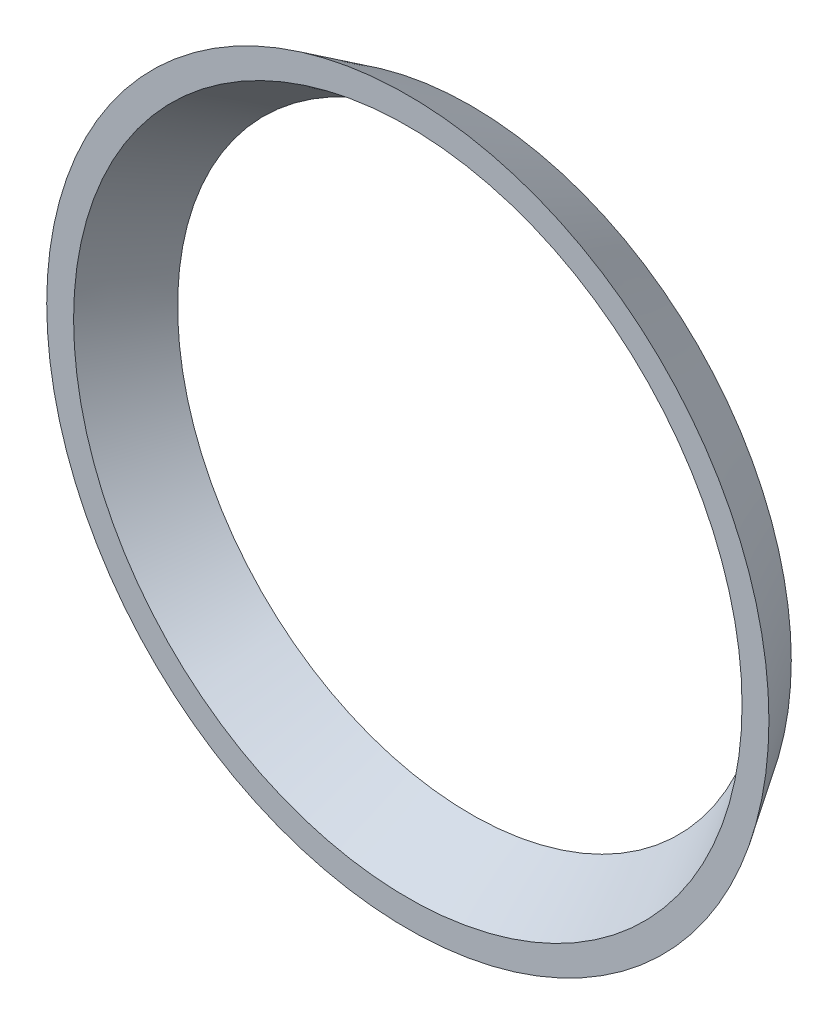
ISO-10303-21;
HEADER;
FILE_DESCRIPTION(('STEP AP214'),'2;1');
FILE_NAME('part.step','',(''),(''),'','','');
FILE_SCHEMA(('AUTOMOTIVE_DESIGN { 1 0 10303 214 1 1 1 1 }'));
ENDSEC;
DATA;
#1=APPLICATION_CONTEXT('core data for automotive mechanical design processes');
#2=APPLICATION_PROTOCOL_DEFINITION('international standard','automotive_design',2000,#1);
#3=PRODUCT_CONTEXT('',#1,'mechanical');
#4=PRODUCT('Part','Part','',(#3));
#5=PRODUCT_RELATED_PRODUCT_CATEGORY('part','',(#4));
#6=PRODUCT_DEFINITION_FORMATION('','',#4);
#7=PRODUCT_DEFINITION_CONTEXT('part definition',#1,'design');
#8=PRODUCT_DEFINITION('design','',#6,#7);
#9=PRODUCT_DEFINITION_SHAPE('','',#8);
#10=(LENGTH_UNIT() NAMED_UNIT(*) SI_UNIT(.MILLI.,.METRE.));
#11=(NAMED_UNIT(*) PLANE_ANGLE_UNIT() SI_UNIT($,.RADIAN.));
#12=(NAMED_UNIT(*) SI_UNIT($,.STERADIAN.) SOLID_ANGLE_UNIT());
#13=UNCERTAINTY_MEASURE_WITH_UNIT(LENGTH_MEASURE(1.E-05),#10,'distance_accuracy_value','');
#14=(GEOMETRIC_REPRESENTATION_CONTEXT(3) GLOBAL_UNCERTAINTY_ASSIGNED_CONTEXT((#13)) GLOBAL_UNIT_ASSIGNED_CONTEXT((#10,
#11,#12)) REPRESENTATION_CONTEXT('',''));
#15=CARTESIAN_POINT('',(0.,0.,0.));
#16=DIRECTION('',(0.,0.,1.));
#17=DIRECTION('',(1.,0.,0.));
#18=AXIS2_PLACEMENT_3D('',#15,#16,#17);
#19=CARTESIAN_POINT('',(0.,18.5117216199572,0.));
#20=DIRECTION('',(0.,0.,-1.));
#21=DIRECTION('',(-1.,0.,0.));
#22=AXIS2_PLACEMENT_3D('',#19,#20,#21);
#23=PLANE('',#22);
#24=CARTESIAN_POINT('',(0.,0.,0.));
#25=DIRECTION('',(0.,0.,1.));
#26=DIRECTION('',(1.,0.,0.));
#27=AXIS2_PLACEMENT_3D('',#24,#25,#26);
#28=CIRCLE('',#27,18.5117216199572);
#29=CARTESIAN_POINT('',(18.5117216199572,0.,0.));
#30=VERTEX_POINT('',#29);
#31=EDGE_CURVE('E53',#30,#30,#28,.T.);
#32=ORIENTED_EDGE('',*,*,#31,.F.);
#33=EDGE_LOOP('',(#32));
#34=FACE_BOUND('',#33,.T.);
#35=CARTESIAN_POINT('',(0.,0.,0.));
#36=DIRECTION('',(0.,0.,1.));
#37=DIRECTION('',(1.,0.,0.));
#38=AXIS2_PLACEMENT_3D('',#35,#36,#37);
#39=CIRCLE('',#38,20.);
#40=CARTESIAN_POINT('',(20.,0.,0.));
#41=VERTEX_POINT('',#40);
#42=EDGE_CURVE('E10',#41,#41,#39,.T.);
#43=ORIENTED_EDGE('',*,*,#42,.T.);
#44=EDGE_LOOP('',(#43));
#45=FACE_BOUND('',#44,.T.);
#46=ADVANCED_FACE('F39',(#34,#45),#23,.F.);
#47=CARTESIAN_POINT('',(0.,0.,-3.5));
#48=DIRECTION('',(0.,0.,1.));
#49=DIRECTION('',(1.,0.,0.));
#50=AXIS2_PLACEMENT_3D('',#47,#48,#49);
#51=CONICAL_SURFACE('',#50,17.7382783800428,0.573703584698932);
#52=ORIENTED_EDGE('',*,*,#42,.F.);
#53=EDGE_LOOP('',(#52));
#54=FACE_BOUND('',#53,.T.);
#55=CARTESIAN_POINT('',(0.,0.,-3.5));
#56=DIRECTION('',(0.,0.,1.));
#57=DIRECTION('',(1.,0.,0.));
#58=AXIS2_PLACEMENT_3D('',#55,#56,#57);
#59=CIRCLE('',#58,17.7382783800428);
#60=CARTESIAN_POINT('',(17.7382783800428,0.,-3.5));
#61=VERTEX_POINT('',#60);
#62=EDGE_CURVE('E45',#61,#61,#59,.T.);
#63=ORIENTED_EDGE('',*,*,#62,.T.);
#64=EDGE_LOOP('',(#63));
#65=FACE_BOUND('',#64,.T.);
#66=ADVANCED_FACE('F62',(#54,#65),#51,.T.);
#67=CARTESIAN_POINT('',(0.,16.25,-3.5));
#68=DIRECTION('',(0.,0.,1.));
#69=DIRECTION('',(1.,0.,0.));
#70=AXIS2_PLACEMENT_3D('',#67,#68,#69);
#71=PLANE('',#70);
#72=ORIENTED_EDGE('',*,*,#62,.F.);
#73=EDGE_LOOP('',(#72));
#74=FACE_BOUND('',#73,.T.);
#75=CARTESIAN_POINT('',(0.,0.,-3.5));
#76=DIRECTION('',(0.,0.,1.));
#77=DIRECTION('',(1.,0.,0.));
#78=AXIS2_PLACEMENT_3D('',#75,#76,#77);
#79=CIRCLE('',#78,16.25);
#80=CARTESIAN_POINT('',(16.25,0.,-3.5));
#81=VERTEX_POINT('',#80);
#82=EDGE_CURVE('E49',#81,#81,#79,.T.);
#83=ORIENTED_EDGE('',*,*,#82,.T.);
#84=EDGE_LOOP('',(#83));
#85=FACE_BOUND('',#84,.T.);
#86=ADVANCED_FACE('F66',(#74,#85),#71,.F.);
#87=CARTESIAN_POINT('',(0.,0.,0.));
#88=DIRECTION('',(0.,0.,1.));
#89=DIRECTION('',(1.,0.,0.));
#90=AXIS2_PLACEMENT_3D('',#87,#88,#89);
#91=CONICAL_SURFACE('',#90,18.5117216199572,0.573703584698933);
#92=ORIENTED_EDGE('',*,*,#82,.F.);
#93=EDGE_LOOP('',(#92));
#94=FACE_BOUND('',#93,.T.);
#95=ORIENTED_EDGE('',*,*,#31,.T.);
#96=EDGE_LOOP('',(#95));
#97=FACE_BOUND('',#96,.T.);
#98=ADVANCED_FACE('F59',(#94,#97),#91,.F.);
#99=CLOSED_SHELL('',(#46,#66,#86,#98));
#100=MANIFOLD_SOLID_BREP('B2',#99);
#101=ADVANCED_BREP_SHAPE_REPRESENTATION('',(#18,#100),#14);
#102=SHAPE_DEFINITION_REPRESENTATION(#9,#101);
ENDSEC;
END-ISO-10303-21;
